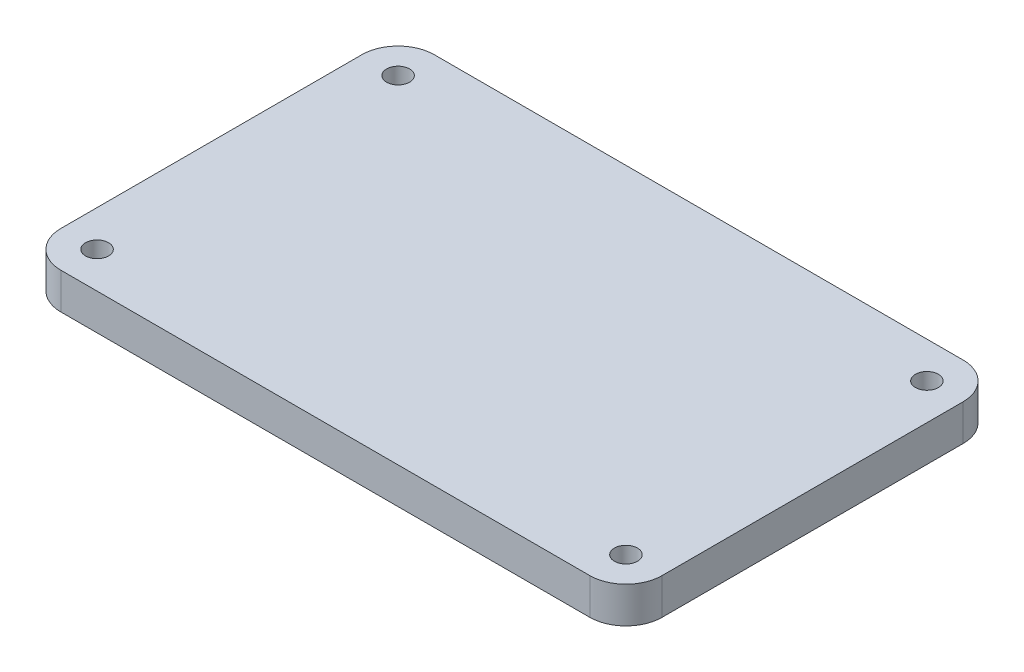
ISO-10303-21;
HEADER;
FILE_DESCRIPTION(('STEP AP214'),'2;1');
FILE_NAME('part.step','',(''),(''),'','','');
FILE_SCHEMA(('AUTOMOTIVE_DESIGN { 1 0 10303 214 1 1 1 1 }'));
ENDSEC;
DATA;
#1=APPLICATION_CONTEXT('core data for automotive mechanical design processes');
#2=APPLICATION_PROTOCOL_DEFINITION('international standard','automotive_design',2000,#1);
#3=PRODUCT_CONTEXT('',#1,'mechanical');
#4=PRODUCT('Part','Part','',(#3));
#5=PRODUCT_RELATED_PRODUCT_CATEGORY('part','',(#4));
#6=PRODUCT_DEFINITION_FORMATION('','',#4);
#7=PRODUCT_DEFINITION_CONTEXT('part definition',#1,'design');
#8=PRODUCT_DEFINITION('design','',#6,#7);
#9=PRODUCT_DEFINITION_SHAPE('','',#8);
#10=(LENGTH_UNIT() NAMED_UNIT(*) SI_UNIT(.MILLI.,.METRE.));
#11=(NAMED_UNIT(*) PLANE_ANGLE_UNIT() SI_UNIT($,.RADIAN.));
#12=(NAMED_UNIT(*) SI_UNIT($,.STERADIAN.) SOLID_ANGLE_UNIT());
#13=UNCERTAINTY_MEASURE_WITH_UNIT(LENGTH_MEASURE(1.E-05),#10,'distance_accuracy_value','');
#14=(GEOMETRIC_REPRESENTATION_CONTEXT(3) GLOBAL_UNCERTAINTY_ASSIGNED_CONTEXT((#13)) GLOBAL_UNIT_ASSIGNED_CONTEXT((#10,
#11,#12)) REPRESENTATION_CONTEXT('',''));
#15=CARTESIAN_POINT('',(0.,0.,0.));
#16=DIRECTION('',(0.,0.,1.));
#17=DIRECTION('',(1.,0.,0.));
#18=AXIS2_PLACEMENT_3D('',#15,#16,#17);
#19=CARTESIAN_POINT('',(0.,273.05,438.891637614562));
#20=DIRECTION('',(0.,0.,1.));
#21=DIRECTION('',(1.,0.,0.));
#22=AXIS2_PLACEMENT_3D('',#19,#20,#21);
#23=PLANE('',#22);
#24=DIRECTION('',(1.,0.,0.));
#25=VECTOR('',#24,1.);
#26=CARTESIAN_POINT('',(0.,279.4,438.891637614562));
#27=LINE('',#26,#25);
#28=CARTESIAN_POINT('',(-46.4038061,279.4,438.891637614562));
#29=VERTEX_POINT('',#28);
#30=CARTESIAN_POINT('',(46.4038061000002,279.4,438.891637614562));
#31=VERTEX_POINT('',#30);
#32=EDGE_CURVE('E173',#29,#31,#27,.T.);
#33=ORIENTED_EDGE('',*,*,#32,.F.);
#34=DIRECTION('',(0.,1.,0.));
#35=VECTOR('',#34,1.);
#36=CARTESIAN_POINT('',(-46.4038061,273.05,438.891637614562));
#37=LINE('',#36,#35);
#38=CARTESIAN_POINT('',(-46.4038061,273.05,438.891637614562));
#39=VERTEX_POINT('',#38);
#40=EDGE_CURVE('E26',#29,#39,#37,.F.);
#41=ORIENTED_EDGE('',*,*,#40,.T.);
#42=DIRECTION('',(1.,0.,0.));
#43=VECTOR('',#42,1.);
#44=CARTESIAN_POINT('',(0.,273.05,438.891637614562));
#45=LINE('',#44,#43);
#46=CARTESIAN_POINT('',(46.4038061000002,273.05,438.891637614562));
#47=VERTEX_POINT('',#46);
#48=EDGE_CURVE('E177',#39,#47,#45,.T.);
#49=ORIENTED_EDGE('',*,*,#48,.T.);
#50=DIRECTION('',(0.,1.,0.));
#51=VECTOR('',#50,1.);
#52=CARTESIAN_POINT('',(46.4038061000002,273.05,438.891637614562));
#53=LINE('',#52,#51);
#54=EDGE_CURVE('E137',#47,#31,#53,.T.);
#55=ORIENTED_EDGE('',*,*,#54,.T.);
#56=EDGE_LOOP('',(#33,#41,#49,#55));
#57=FACE_BOUND('',#56,.T.);
#58=ADVANCED_FACE('F17',(#57),#23,.T.);
#59=CARTESIAN_POINT('',(-52.7538061,273.05,406.13245097417));
#60=DIRECTION('',(1.,0.,0.));
#61=DIRECTION('',(0.,1.,0.));
#62=AXIS2_PLACEMENT_3D('',#59,#60,#61);
#63=PLANE('',#62);
#64=DIRECTION('',(0.,0.,-1.));
#65=VECTOR('',#64,1.);
#66=CARTESIAN_POINT('',(-52.7538061,273.05,406.13245097417));
#67=LINE('',#66,#65);
#68=CARTESIAN_POINT('',(-52.7538061,273.05,432.541637614562));
#69=VERTEX_POINT('',#68);
#70=CARTESIAN_POINT('',(-52.7538061,273.05,379.723264333778));
#71=VERTEX_POINT('',#70);
#72=EDGE_CURVE('E184',#69,#71,#67,.T.);
#73=ORIENTED_EDGE('',*,*,#72,.F.);
#74=DIRECTION('',(0.,1.,0.));
#75=VECTOR('',#74,1.);
#76=CARTESIAN_POINT('',(-52.7538061,279.4,432.541637614562));
#77=LINE('',#76,#75);
#78=CARTESIAN_POINT('',(-52.7538061,279.4,432.541637614562));
#79=VERTEX_POINT('',#78);
#80=EDGE_CURVE('E150',#69,#79,#77,.T.);
#81=ORIENTED_EDGE('',*,*,#80,.T.);
#82=DIRECTION('',(0.,0.,-1.));
#83=VECTOR('',#82,1.);
#84=CARTESIAN_POINT('',(-52.7538061,279.4,406.13245097417));
#85=LINE('',#84,#83);
#86=CARTESIAN_POINT('',(-52.7538061,279.4,379.723264333778));
#87=VERTEX_POINT('',#86);
#88=EDGE_CURVE('E172',#79,#87,#85,.T.);
#89=ORIENTED_EDGE('',*,*,#88,.T.);
#90=DIRECTION('',(0.,1.,0.));
#91=VECTOR('',#90,1.);
#92=CARTESIAN_POINT('',(-52.7538061,273.05,379.723264333778));
#93=LINE('',#92,#91);
#94=EDGE_CURVE('E130',#87,#71,#93,.F.);
#95=ORIENTED_EDGE('',*,*,#94,.T.);
#96=EDGE_LOOP('',(#73,#81,#89,#95));
#97=FACE_BOUND('',#96,.T.);
#98=ADVANCED_FACE('F205',(#97),#63,.F.);
#99=CARTESIAN_POINT('',(0.,273.05,373.373264333778));
#100=DIRECTION('',(0.,0.,1.));
#101=DIRECTION('',(1.,0.,0.));
#102=AXIS2_PLACEMENT_3D('',#99,#100,#101);
#103=PLANE('',#102);
#104=DIRECTION('',(1.,0.,0.));
#105=VECTOR('',#104,1.);
#106=CARTESIAN_POINT('',(0.,273.05,373.373264333778));
#107=LINE('',#106,#105);
#108=CARTESIAN_POINT('',(-46.4038061,273.05,373.373264333778));
#109=VERTEX_POINT('',#108);
#110=CARTESIAN_POINT('',(46.4038061000002,273.05,373.373264333778));
#111=VERTEX_POINT('',#110);
#112=EDGE_CURVE('E113',#109,#111,#107,.T.);
#113=ORIENTED_EDGE('',*,*,#112,.F.);
#114=DIRECTION('',(0.,1.,0.));
#115=VECTOR('',#114,1.);
#116=CARTESIAN_POINT('',(-46.4038061,273.05,373.373264333778));
#117=LINE('',#116,#115);
#118=CARTESIAN_POINT('',(-46.4038061,279.4,373.373264333778));
#119=VERTEX_POINT('',#118);
#120=EDGE_CURVE('E122',#109,#119,#117,.T.);
#121=ORIENTED_EDGE('',*,*,#120,.T.);
#122=DIRECTION('',(1.,0.,0.));
#123=VECTOR('',#122,1.);
#124=CARTESIAN_POINT('',(0.,279.4,373.373264333778));
#125=LINE('',#124,#123);
#126=CARTESIAN_POINT('',(46.4038061000002,279.4,373.373264333778));
#127=VERTEX_POINT('',#126);
#128=EDGE_CURVE('E93',#119,#127,#125,.T.);
#129=ORIENTED_EDGE('',*,*,#128,.T.);
#130=DIRECTION('',(0.,1.,0.));
#131=VECTOR('',#130,1.);
#132=CARTESIAN_POINT('',(46.4038061000002,273.05,373.373264333778));
#133=LINE('',#132,#131);
#134=EDGE_CURVE('E101',#127,#111,#133,.F.);
#135=ORIENTED_EDGE('',*,*,#134,.T.);
#136=EDGE_LOOP('',(#113,#121,#129,#135));
#137=FACE_BOUND('',#136,.T.);
#138=ADVANCED_FACE('F210',(#137),#103,.F.);
#139=CARTESIAN_POINT('',(-46.4038061,273.05,432.541637614562));
#140=DIRECTION('',(0.,1.,0.));
#141=DIRECTION('',(-1.,0.,0.));
#142=AXIS2_PLACEMENT_3D('',#139,#140,#141);
#143=CYLINDRICAL_SURFACE('',#142,2.0193);
#144=CARTESIAN_POINT('',(-46.4038061,273.05,432.541637614562));
#145=DIRECTION('',(0.,-1.,0.));
#146=DIRECTION('',(1.,0.,0.));
#147=AXIS2_PLACEMENT_3D('',#144,#145,#146);
#148=CIRCLE('',#147,2.0193);
#149=CARTESIAN_POINT('',(-44.3845061,273.05,432.541637614562));
#150=VERTEX_POINT('',#149);
#151=EDGE_CURVE('E163',#150,#150,#148,.T.);
#152=ORIENTED_EDGE('',*,*,#151,.T.);
#153=EDGE_LOOP('',(#152));
#154=FACE_BOUND('',#153,.T.);
#155=CARTESIAN_POINT('',(-46.4038061,279.4,432.541637614562));
#156=DIRECTION('',(0.,-1.,0.));
#157=DIRECTION('',(1.,0.,0.));
#158=AXIS2_PLACEMENT_3D('',#155,#156,#157);
#159=CIRCLE('',#158,2.0193);
#160=CARTESIAN_POINT('',(-44.3845061,279.4,432.541637614562));
#161=VERTEX_POINT('',#160);
#162=EDGE_CURVE('E169',#161,#161,#159,.T.);
#163=ORIENTED_EDGE('',*,*,#162,.F.);
#164=EDGE_LOOP('',(#163));
#165=FACE_BOUND('',#164,.T.);
#166=ADVANCED_FACE('F215',(#154,#165),#143,.F.);
#167=CARTESIAN_POINT('',(-46.4038061,273.05,379.723264333778));
#168=DIRECTION('',(0.,1.,0.));
#169=DIRECTION('',(-1.,0.,0.));
#170=AXIS2_PLACEMENT_3D('',#167,#168,#169);
#171=CYLINDRICAL_SURFACE('',#170,2.0193);
#172=CARTESIAN_POINT('',(-46.4038061,273.05,379.723264333778));
#173=DIRECTION('',(0.,-1.,0.));
#174=DIRECTION('',(1.,0.,0.));
#175=AXIS2_PLACEMENT_3D('',#172,#173,#174);
#176=CIRCLE('',#175,2.0193);
#177=CARTESIAN_POINT('',(-44.3845061,273.05,379.723264333778));
#178=VERTEX_POINT('',#177);
#179=EDGE_CURVE('E160',#178,#178,#176,.T.);
#180=ORIENTED_EDGE('',*,*,#179,.T.);
#181=EDGE_LOOP('',(#180));
#182=FACE_BOUND('',#181,.T.);
#183=CARTESIAN_POINT('',(-46.4038061,279.4,379.723264333778));
#184=DIRECTION('',(0.,-1.,0.));
#185=DIRECTION('',(1.,0.,0.));
#186=AXIS2_PLACEMENT_3D('',#183,#184,#185);
#187=CIRCLE('',#186,2.0193);
#188=CARTESIAN_POINT('',(-44.3845061,279.4,379.723264333778));
#189=VERTEX_POINT('',#188);
#190=EDGE_CURVE('E166',#189,#189,#187,.T.);
#191=ORIENTED_EDGE('',*,*,#190,.F.);
#192=EDGE_LOOP('',(#191));
#193=FACE_BOUND('',#192,.T.);
#194=ADVANCED_FACE('F218',(#182,#193),#171,.F.);
#195=CARTESIAN_POINT('',(46.4038061000001,273.05,432.541637614562));
#196=DIRECTION('',(0.,1.,0.));
#197=DIRECTION('',(-1.,0.,0.));
#198=AXIS2_PLACEMENT_3D('',#195,#196,#197);
#199=CYLINDRICAL_SURFACE('',#198,2.0193);
#200=CARTESIAN_POINT('',(46.4038061000001,273.05,432.541637614562));
#201=DIRECTION('',(0.,-1.,0.));
#202=DIRECTION('',(1.,0.,0.));
#203=AXIS2_PLACEMENT_3D('',#200,#201,#202);
#204=CIRCLE('',#203,2.0193);
#205=CARTESIAN_POINT('',(48.4231061000001,273.05,432.541637614562));
#206=VERTEX_POINT('',#205);
#207=EDGE_CURVE('E164',#206,#206,#204,.T.);
#208=ORIENTED_EDGE('',*,*,#207,.T.);
#209=EDGE_LOOP('',(#208));
#210=FACE_BOUND('',#209,.T.);
#211=CARTESIAN_POINT('',(46.4038061000001,279.4,432.541637614562));
#212=DIRECTION('',(0.,-1.,0.));
#213=DIRECTION('',(1.,0.,0.));
#214=AXIS2_PLACEMENT_3D('',#211,#212,#213);
#215=CIRCLE('',#214,2.0193);
#216=CARTESIAN_POINT('',(48.4231061000001,279.4,432.541637614562));
#217=VERTEX_POINT('',#216);
#218=EDGE_CURVE('E170',#217,#217,#215,.T.);
#219=ORIENTED_EDGE('',*,*,#218,.F.);
#220=EDGE_LOOP('',(#219));
#221=FACE_BOUND('',#220,.T.);
#222=ADVANCED_FACE('F222',(#210,#221),#199,.F.);
#223=CARTESIAN_POINT('',(46.4038061000001,273.05,379.723264333778));
#224=DIRECTION('',(0.,1.,0.));
#225=DIRECTION('',(-1.,0.,0.));
#226=AXIS2_PLACEMENT_3D('',#223,#224,#225);
#227=CYLINDRICAL_SURFACE('',#226,2.0193);
#228=CARTESIAN_POINT('',(46.4038061000001,273.05,379.723264333778));
#229=DIRECTION('',(0.,-1.,0.));
#230=DIRECTION('',(1.,0.,0.));
#231=AXIS2_PLACEMENT_3D('',#228,#229,#230);
#232=CIRCLE('',#231,2.0193);
#233=CARTESIAN_POINT('',(48.4231061000001,273.05,379.723264333778));
#234=VERTEX_POINT('',#233);
#235=EDGE_CURVE('E92',#234,#234,#232,.T.);
#236=ORIENTED_EDGE('',*,*,#235,.T.);
#237=EDGE_LOOP('',(#236));
#238=FACE_BOUND('',#237,.T.);
#239=CARTESIAN_POINT('',(46.4038061000001,279.4,379.723264333778));
#240=DIRECTION('',(0.,-1.,0.));
#241=DIRECTION('',(1.,0.,0.));
#242=AXIS2_PLACEMENT_3D('',#239,#240,#241);
#243=CIRCLE('',#242,2.0193);
#244=CARTESIAN_POINT('',(48.4231061000001,279.4,379.723264333778));
#245=VERTEX_POINT('',#244);
#246=EDGE_CURVE('E191',#245,#245,#243,.T.);
#247=ORIENTED_EDGE('',*,*,#246,.F.);
#248=EDGE_LOOP('',(#247));
#249=FACE_BOUND('',#248,.T.);
#250=ADVANCED_FACE('F226',(#238,#249),#227,.F.);
#251=CARTESIAN_POINT('',(52.7538061000002,273.05,406.13245097417));
#252=DIRECTION('',(1.,0.,0.));
#253=DIRECTION('',(0.,1.,0.));
#254=AXIS2_PLACEMENT_3D('',#251,#252,#253);
#255=PLANE('',#254);
#256=DIRECTION('',(0.,0.,-1.));
#257=VECTOR('',#256,1.);
#258=CARTESIAN_POINT('',(52.7538061000002,279.4,406.13245097417));
#259=LINE('',#258,#257);
#260=CARTESIAN_POINT('',(52.7538061000002,279.4,432.541637614562));
#261=VERTEX_POINT('',#260);
#262=CARTESIAN_POINT('',(52.7538061000002,279.4,379.723264333778));
#263=VERTEX_POINT('',#262);
#264=EDGE_CURVE('E80',#261,#263,#259,.T.);
#265=ORIENTED_EDGE('',*,*,#264,.F.);
#266=DIRECTION('',(0.,1.,0.));
#267=VECTOR('',#266,1.);
#268=CARTESIAN_POINT('',(52.7538061000002,273.05,432.541637614562));
#269=LINE('',#268,#267);
#270=CARTESIAN_POINT('',(52.7538061000002,273.05,432.541637614562));
#271=VERTEX_POINT('',#270);
#272=EDGE_CURVE('E143',#261,#271,#269,.F.);
#273=ORIENTED_EDGE('',*,*,#272,.T.);
#274=DIRECTION('',(0.,0.,-1.));
#275=VECTOR('',#274,1.);
#276=CARTESIAN_POINT('',(52.7538061000002,273.05,406.13245097417));
#277=LINE('',#276,#275);
#278=CARTESIAN_POINT('',(52.7538061000002,273.05,379.723264333778));
#279=VERTEX_POINT('',#278);
#280=EDGE_CURVE('E106',#271,#279,#277,.T.);
#281=ORIENTED_EDGE('',*,*,#280,.T.);
#282=DIRECTION('',(0.,1.,0.));
#283=VECTOR('',#282,1.);
#284=CARTESIAN_POINT('',(52.7538061000002,279.4,379.723264333778));
#285=LINE('',#284,#283);
#286=EDGE_CURVE('E99',#279,#263,#285,.T.);
#287=ORIENTED_EDGE('',*,*,#286,.T.);
#288=EDGE_LOOP('',(#265,#273,#281,#287));
#289=FACE_BOUND('',#288,.T.);
#290=ADVANCED_FACE('F104',(#289),#255,.T.);
#291=CARTESIAN_POINT('',(0.,273.05,323.05625));
#292=DIRECTION('',(0.,-1.,0.));
#293=DIRECTION('',(1.,0.,0.));
#294=AXIS2_PLACEMENT_3D('',#291,#292,#293);
#295=PLANE('',#294);
#296=ORIENTED_EDGE('',*,*,#235,.F.);
#297=EDGE_LOOP('',(#296));
#298=FACE_BOUND('',#297,.T.);
#299=ORIENTED_EDGE('',*,*,#207,.F.);
#300=EDGE_LOOP('',(#299));
#301=FACE_BOUND('',#300,.T.);
#302=ORIENTED_EDGE('',*,*,#179,.F.);
#303=EDGE_LOOP('',(#302));
#304=FACE_BOUND('',#303,.T.);
#305=ORIENTED_EDGE('',*,*,#151,.F.);
#306=EDGE_LOOP('',(#305));
#307=FACE_BOUND('',#306,.T.);
#308=ORIENTED_EDGE('',*,*,#48,.F.);
#309=CARTESIAN_POINT('',(-46.4038061,273.05,432.541637614562));
#310=DIRECTION('',(0.,-1.,0.));
#311=DIRECTION('',(1.,0.,0.));
#312=AXIS2_PLACEMENT_3D('',#309,#310,#311);
#313=CIRCLE('',#312,6.35);
#314=EDGE_CURVE('E11',#39,#69,#313,.T.);
#315=ORIENTED_EDGE('',*,*,#314,.T.);
#316=ORIENTED_EDGE('',*,*,#72,.T.);
#317=CARTESIAN_POINT('',(-46.4038061,273.05,379.723264333778));
#318=DIRECTION('',(0.,-1.,0.));
#319=DIRECTION('',(1.,0.,0.));
#320=AXIS2_PLACEMENT_3D('',#317,#318,#319);
#321=CIRCLE('',#320,6.35);
#322=EDGE_CURVE('E134',#71,#109,#321,.T.);
#323=ORIENTED_EDGE('',*,*,#322,.T.);
#324=ORIENTED_EDGE('',*,*,#112,.T.);
#325=CARTESIAN_POINT('',(46.4038061000002,273.05,379.723264333778));
#326=DIRECTION('',(0.,-1.,0.));
#327=DIRECTION('',(1.,0.,0.));
#328=AXIS2_PLACEMENT_3D('',#325,#326,#327);
#329=CIRCLE('',#328,6.35);
#330=EDGE_CURVE('E119',#111,#279,#329,.T.);
#331=ORIENTED_EDGE('',*,*,#330,.T.);
#332=ORIENTED_EDGE('',*,*,#280,.F.);
#333=CARTESIAN_POINT('',(46.4038061000002,273.05,432.541637614562));
#334=DIRECTION('',(0.,-1.,0.));
#335=DIRECTION('',(1.,0.,0.));
#336=AXIS2_PLACEMENT_3D('',#333,#334,#335);
#337=CIRCLE('',#336,6.35);
#338=EDGE_CURVE('E146',#271,#47,#337,.T.);
#339=ORIENTED_EDGE('',*,*,#338,.T.);
#340=EDGE_LOOP('',(#308,#315,#316,#323,#324,#331,#332,#339));
#341=FACE_BOUND('',#340,.T.);
#342=ADVANCED_FACE('F245',(#298,#301,#304,#307,#341),#295,.T.);
#343=CARTESIAN_POINT('',(0.,279.4,323.05625));
#344=DIRECTION('',(0.,-1.,0.));
#345=DIRECTION('',(1.,0.,0.));
#346=AXIS2_PLACEMENT_3D('',#343,#344,#345);
#347=PLANE('',#346);
#348=ORIENTED_EDGE('',*,*,#246,.T.);
#349=EDGE_LOOP('',(#348));
#350=FACE_BOUND('',#349,.T.);
#351=ORIENTED_EDGE('',*,*,#218,.T.);
#352=EDGE_LOOP('',(#351));
#353=FACE_BOUND('',#352,.T.);
#354=ORIENTED_EDGE('',*,*,#190,.T.);
#355=EDGE_LOOP('',(#354));
#356=FACE_BOUND('',#355,.T.);
#357=ORIENTED_EDGE('',*,*,#162,.T.);
#358=EDGE_LOOP('',(#357));
#359=FACE_BOUND('',#358,.T.);
#360=ORIENTED_EDGE('',*,*,#88,.F.);
#361=CARTESIAN_POINT('',(-46.4038061,279.4,432.541637614562));
#362=DIRECTION('',(0.,-1.,0.));
#363=DIRECTION('',(1.,0.,0.));
#364=AXIS2_PLACEMENT_3D('',#361,#362,#363);
#365=CIRCLE('',#364,6.35);
#366=EDGE_CURVE('E40',#79,#29,#365,.F.);
#367=ORIENTED_EDGE('',*,*,#366,.T.);
#368=ORIENTED_EDGE('',*,*,#32,.T.);
#369=CARTESIAN_POINT('',(46.4038061000002,279.4,432.541637614562));
#370=DIRECTION('',(0.,-1.,0.));
#371=DIRECTION('',(1.,0.,0.));
#372=AXIS2_PLACEMENT_3D('',#369,#370,#371);
#373=CIRCLE('',#372,6.35);
#374=EDGE_CURVE('E87',#31,#261,#373,.F.);
#375=ORIENTED_EDGE('',*,*,#374,.T.);
#376=ORIENTED_EDGE('',*,*,#264,.T.);
#377=CARTESIAN_POINT('',(46.4038061000002,279.4,379.723264333778));
#378=DIRECTION('',(0.,-1.,0.));
#379=DIRECTION('',(1.,0.,0.));
#380=AXIS2_PLACEMENT_3D('',#377,#378,#379);
#381=CIRCLE('',#380,6.35);
#382=EDGE_CURVE('E84',#263,#127,#381,.F.);
#383=ORIENTED_EDGE('',*,*,#382,.T.);
#384=ORIENTED_EDGE('',*,*,#128,.F.);
#385=CARTESIAN_POINT('',(-46.4038061,279.4,379.723264333778));
#386=DIRECTION('',(0.,-1.,0.));
#387=DIRECTION('',(1.,0.,0.));
#388=AXIS2_PLACEMENT_3D('',#385,#386,#387);
#389=CIRCLE('',#388,6.35);
#390=EDGE_CURVE('E126',#119,#87,#389,.F.);
#391=ORIENTED_EDGE('',*,*,#390,.T.);
#392=EDGE_LOOP('',(#360,#367,#368,#375,#376,#383,#384,#391));
#393=FACE_BOUND('',#392,.T.);
#394=ADVANCED_FACE('F82',(#350,#353,#356,#359,#393),#347,.F.);
#395=CARTESIAN_POINT('',(46.4038061000002,273.05,379.723264333778));
#396=DIRECTION('',(0.,-1.,0.));
#397=DIRECTION('',(1.,0.,0.));
#398=AXIS2_PLACEMENT_3D('',#395,#396,#397);
#399=CYLINDRICAL_SURFACE('',#398,6.35);
#400=ORIENTED_EDGE('',*,*,#330,.F.);
#401=ORIENTED_EDGE('',*,*,#134,.F.);
#402=ORIENTED_EDGE('',*,*,#382,.F.);
#403=ORIENTED_EDGE('',*,*,#286,.F.);
#404=EDGE_LOOP('',(#400,#401,#402,#403));
#405=FACE_BOUND('',#404,.T.);
#406=ADVANCED_FACE('F98',(#405),#399,.T.);
#407=CARTESIAN_POINT('',(-46.4038061,273.05,379.723264333778));
#408=DIRECTION('',(0.,1.,0.));
#409=DIRECTION('',(-1.,0.,0.));
#410=AXIS2_PLACEMENT_3D('',#407,#408,#409);
#411=CYLINDRICAL_SURFACE('',#410,6.35);
#412=ORIENTED_EDGE('',*,*,#322,.F.);
#413=ORIENTED_EDGE('',*,*,#94,.F.);
#414=ORIENTED_EDGE('',*,*,#390,.F.);
#415=ORIENTED_EDGE('',*,*,#120,.F.);
#416=EDGE_LOOP('',(#412,#413,#414,#415));
#417=FACE_BOUND('',#416,.T.);
#418=ADVANCED_FACE('F233',(#417),#411,.T.);
#419=CARTESIAN_POINT('',(46.4038061000002,273.05,432.541637614562));
#420=DIRECTION('',(0.,1.,0.));
#421=DIRECTION('',(-1.,0.,0.));
#422=AXIS2_PLACEMENT_3D('',#419,#420,#421);
#423=CYLINDRICAL_SURFACE('',#422,6.35);
#424=ORIENTED_EDGE('',*,*,#338,.F.);
#425=ORIENTED_EDGE('',*,*,#272,.F.);
#426=ORIENTED_EDGE('',*,*,#374,.F.);
#427=ORIENTED_EDGE('',*,*,#54,.F.);
#428=EDGE_LOOP('',(#424,#425,#426,#427));
#429=FACE_BOUND('',#428,.T.);
#430=ADVANCED_FACE('F203',(#429),#423,.T.);
#431=CARTESIAN_POINT('',(-46.4038061,273.05,432.541637614562));
#432=DIRECTION('',(0.,-1.,0.));
#433=DIRECTION('',(1.,0.,0.));
#434=AXIS2_PLACEMENT_3D('',#431,#432,#433);
#435=CYLINDRICAL_SURFACE('',#434,6.35);
#436=ORIENTED_EDGE('',*,*,#314,.F.);
#437=ORIENTED_EDGE('',*,*,#40,.F.);
#438=ORIENTED_EDGE('',*,*,#366,.F.);
#439=ORIENTED_EDGE('',*,*,#80,.F.);
#440=EDGE_LOOP('',(#436,#437,#438,#439));
#441=FACE_BOUND('',#440,.T.);
#442=ADVANCED_FACE('F19',(#441),#435,.T.);
#443=CLOSED_SHELL('',(#58,#98,#138,#166,#194,#222,#250,#290,#342,#394,#406,#418,#430,#442));
#444=MANIFOLD_SOLID_BREP('B1',#443);
#445=ADVANCED_BREP_SHAPE_REPRESENTATION('',(#18,#444),#14);
#446=SHAPE_DEFINITION_REPRESENTATION(#9,#445);
ENDSEC;
END-ISO-10303-21;
